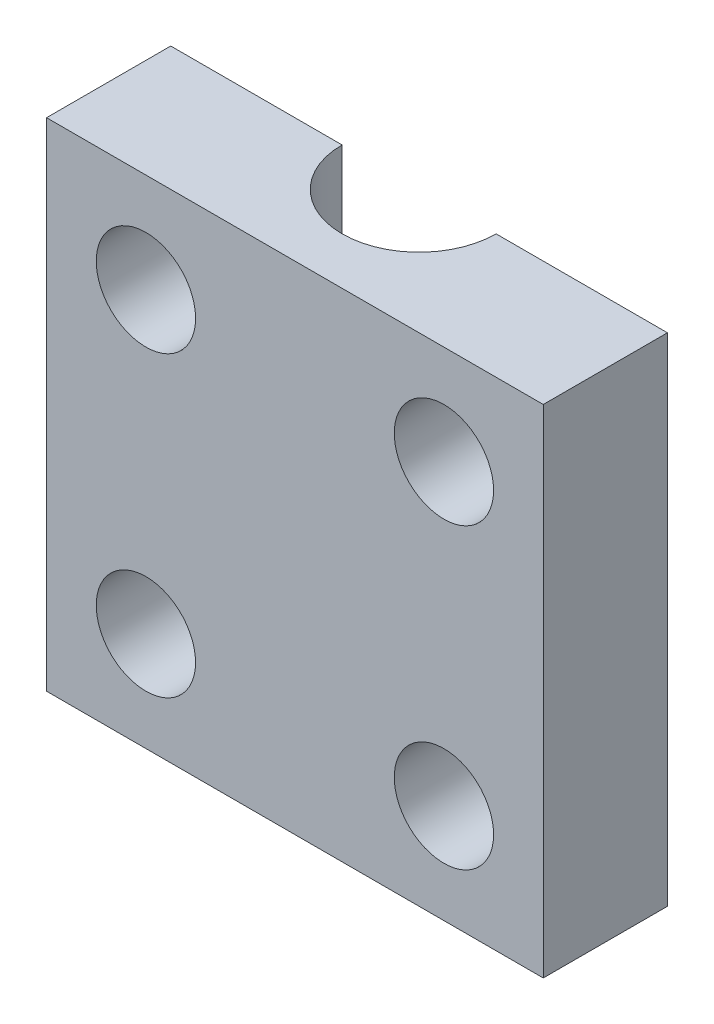
ISO-10303-21;
HEADER;
FILE_DESCRIPTION(('STEP AP214'),'2;1');
FILE_NAME('part.step','',(''),(''),'','','');
FILE_SCHEMA(('AUTOMOTIVE_DESIGN { 1 0 10303 214 1 1 1 1 }'));
ENDSEC;
DATA;
#1=APPLICATION_CONTEXT('core data for automotive mechanical design processes');
#2=APPLICATION_PROTOCOL_DEFINITION('international standard','automotive_design',2000,#1);
#3=PRODUCT_CONTEXT('',#1,'mechanical');
#4=PRODUCT('Part','Part','',(#3));
#5=PRODUCT_RELATED_PRODUCT_CATEGORY('part','',(#4));
#6=PRODUCT_DEFINITION_FORMATION('','',#4);
#7=PRODUCT_DEFINITION_CONTEXT('part definition',#1,'design');
#8=PRODUCT_DEFINITION('design','',#6,#7);
#9=PRODUCT_DEFINITION_SHAPE('','',#8);
#10=(LENGTH_UNIT() NAMED_UNIT(*) SI_UNIT(.MILLI.,.METRE.));
#11=(NAMED_UNIT(*) PLANE_ANGLE_UNIT() SI_UNIT($,.RADIAN.));
#12=(NAMED_UNIT(*) SI_UNIT($,.STERADIAN.) SOLID_ANGLE_UNIT());
#13=UNCERTAINTY_MEASURE_WITH_UNIT(LENGTH_MEASURE(1.E-05),#10,'distance_accuracy_value','');
#14=(GEOMETRIC_REPRESENTATION_CONTEXT(3) GLOBAL_UNCERTAINTY_ASSIGNED_CONTEXT((#13)) GLOBAL_UNIT_ASSIGNED_CONTEXT((#10,
#11,#12)) REPRESENTATION_CONTEXT('',''));
#15=CARTESIAN_POINT('',(0.,0.,0.));
#16=DIRECTION('',(0.,0.,1.));
#17=DIRECTION('',(1.,0.,0.));
#18=AXIS2_PLACEMENT_3D('',#15,#16,#17);
#19=CARTESIAN_POINT('',(0.,0.,0.));
#20=DIRECTION('',(0.,0.,1.));
#21=DIRECTION('',(1.,0.,0.));
#22=AXIS2_PLACEMENT_3D('',#19,#20,#21);
#23=PLANE('',#22);
#24=CARTESIAN_POINT('',(6.,6.,0.));
#25=DIRECTION('',(0.,0.,1.));
#26=DIRECTION('',(1.,0.,0.));
#27=AXIS2_PLACEMENT_3D('',#24,#25,#26);
#28=CIRCLE('',#27,2.);
#29=CARTESIAN_POINT('',(8.,6.,0.));
#30=VERTEX_POINT('',#29);
#31=EDGE_CURVE('E174',#30,#30,#28,.F.);
#32=ORIENTED_EDGE('',*,*,#31,.F.);
#33=EDGE_LOOP('',(#32));
#34=FACE_BOUND('',#33,.T.);
#35=CARTESIAN_POINT('',(6.,-6.,0.));
#36=DIRECTION('',(0.,0.,1.));
#37=DIRECTION('',(1.,0.,0.));
#38=AXIS2_PLACEMENT_3D('',#35,#36,#37);
#39=CIRCLE('',#38,2.);
#40=CARTESIAN_POINT('',(8.,-6.,0.));
#41=VERTEX_POINT('',#40);
#42=EDGE_CURVE('E183',#41,#41,#39,.F.);
#43=ORIENTED_EDGE('',*,*,#42,.F.);
#44=EDGE_LOOP('',(#43));
#45=FACE_BOUND('',#44,.T.);
#46=DIRECTION('',(1.,0.,0.));
#47=VECTOR('',#46,1.);
#48=CARTESIAN_POINT('',(-10.,-10.,0.));
#49=LINE('',#48,#47);
#50=CARTESIAN_POINT('',(3.1,-10.,0.));
#51=VERTEX_POINT('',#50);
#52=CARTESIAN_POINT('',(10.,-10.,0.));
#53=VERTEX_POINT('',#52);
#54=EDGE_CURVE('E118',#51,#53,#49,.T.);
#55=ORIENTED_EDGE('',*,*,#54,.F.);
#56=DIRECTION('',(0.,1.,0.));
#57=VECTOR('',#56,1.);
#58=CARTESIAN_POINT('',(3.1,-10.001,0.));
#59=LINE('',#58,#57);
#60=CARTESIAN_POINT('',(3.1,10.,0.));
#61=VERTEX_POINT('',#60);
#62=EDGE_CURVE('E108',#61,#51,#59,.F.);
#63=ORIENTED_EDGE('',*,*,#62,.F.);
#64=DIRECTION('',(-1.,0.,0.));
#65=VECTOR('',#64,1.);
#66=CARTESIAN_POINT('',(-10.,10.,0.));
#67=LINE('',#66,#65);
#68=CARTESIAN_POINT('',(10.,10.,0.));
#69=VERTEX_POINT('',#68);
#70=EDGE_CURVE('E117',#69,#61,#67,.T.);
#71=ORIENTED_EDGE('',*,*,#70,.F.);
#72=DIRECTION('',(0.,1.,0.));
#73=VECTOR('',#72,1.);
#74=CARTESIAN_POINT('',(10.,10.,0.));
#75=LINE('',#74,#73);
#76=EDGE_CURVE('E131',#53,#69,#75,.T.);
#77=ORIENTED_EDGE('',*,*,#76,.F.);
#78=EDGE_LOOP('',(#55,#63,#71,#77));
#79=FACE_BOUND('',#78,.T.);
#80=ADVANCED_FACE('F45',(#34,#45,#79),#23,.F.);
#81=CARTESIAN_POINT('',(-10.,10.,5.));
#82=DIRECTION('',(1.,0.,0.));
#83=DIRECTION('',(0.,0.,-1.));
#84=AXIS2_PLACEMENT_3D('',#81,#82,#83);
#85=PLANE('',#84);
#86=DIRECTION('',(0.,-1.,0.));
#87=VECTOR('',#86,1.);
#88=CARTESIAN_POINT('',(-10.,10.,0.));
#89=LINE('',#88,#87);
#90=CARTESIAN_POINT('',(-10.,10.,0.));
#91=VERTEX_POINT('',#90);
#92=CARTESIAN_POINT('',(-10.,-10.,0.));
#93=VERTEX_POINT('',#92);
#94=EDGE_CURVE('E150',#91,#93,#89,.T.);
#95=ORIENTED_EDGE('',*,*,#94,.T.);
#96=DIRECTION('',(0.,0.,-1.));
#97=VECTOR('',#96,1.);
#98=CARTESIAN_POINT('',(-10.,-10.,5.));
#99=LINE('',#98,#97);
#100=CARTESIAN_POINT('',(-10.,-10.,5.));
#101=VERTEX_POINT('',#100);
#102=EDGE_CURVE('E11',#101,#93,#99,.T.);
#103=ORIENTED_EDGE('',*,*,#102,.F.);
#104=DIRECTION('',(0.,-1.,0.));
#105=VECTOR('',#104,1.);
#106=CARTESIAN_POINT('',(-10.,10.,5.));
#107=LINE('',#106,#105);
#108=CARTESIAN_POINT('',(-10.,10.,5.));
#109=VERTEX_POINT('',#108);
#110=EDGE_CURVE('E126',#109,#101,#107,.T.);
#111=ORIENTED_EDGE('',*,*,#110,.F.);
#112=DIRECTION('',(0.,0.,-1.));
#113=VECTOR('',#112,1.);
#114=CARTESIAN_POINT('',(-10.,10.,5.));
#115=LINE('',#114,#113);
#116=EDGE_CURVE('E135',#109,#91,#115,.T.);
#117=ORIENTED_EDGE('',*,*,#116,.T.);
#118=EDGE_LOOP('',(#95,#103,#111,#117));
#119=FACE_BOUND('',#118,.T.);
#120=ADVANCED_FACE('F47',(#119),#85,.F.);
#121=CARTESIAN_POINT('',(-10.,-10.,5.));
#122=DIRECTION('',(0.,1.,0.));
#123=DIRECTION('',(0.,0.,1.));
#124=AXIS2_PLACEMENT_3D('',#121,#122,#123);
#125=PLANE('',#124);
#126=CARTESIAN_POINT('',(-3.1,-10.,0.));
#127=VERTEX_POINT('',#126);
#128=EDGE_CURVE('E146',#93,#127,#49,.T.);
#129=ORIENTED_EDGE('',*,*,#128,.T.);
#130=CARTESIAN_POINT('',(0.,-10.,0.));
#131=DIRECTION('',(0.,1.,0.));
#132=DIRECTION('',(0.,0.,1.));
#133=AXIS2_PLACEMENT_3D('',#130,#131,#132);
#134=CIRCLE('',#133,3.1);
#135=EDGE_CURVE('E61',#51,#127,#134,.F.);
#136=ORIENTED_EDGE('',*,*,#135,.F.);
#137=ORIENTED_EDGE('',*,*,#54,.T.);
#138=DIRECTION('',(0.,0.,-1.));
#139=VECTOR('',#138,1.);
#140=CARTESIAN_POINT('',(10.,-10.,5.));
#141=LINE('',#140,#139);
#142=CARTESIAN_POINT('',(10.,-10.,5.));
#143=VERTEX_POINT('',#142);
#144=EDGE_CURVE('E54',#143,#53,#141,.T.);
#145=ORIENTED_EDGE('',*,*,#144,.F.);
#146=DIRECTION('',(1.,0.,0.));
#147=VECTOR('',#146,1.);
#148=CARTESIAN_POINT('',(-10.,-10.,5.));
#149=LINE('',#148,#147);
#150=EDGE_CURVE('E98',#101,#143,#149,.T.);
#151=ORIENTED_EDGE('',*,*,#150,.F.);
#152=ORIENTED_EDGE('',*,*,#102,.T.);
#153=EDGE_LOOP('',(#129,#136,#137,#145,#151,#152));
#154=FACE_BOUND('',#153,.T.);
#155=ADVANCED_FACE('F212',(#154),#125,.F.);
#156=CARTESIAN_POINT('',(10.,10.,5.));
#157=DIRECTION('',(-1.,0.,0.));
#158=DIRECTION('',(0.,0.,1.));
#159=AXIS2_PLACEMENT_3D('',#156,#157,#158);
#160=PLANE('',#159);
#161=ORIENTED_EDGE('',*,*,#76,.T.);
#162=DIRECTION('',(0.,0.,-1.));
#163=VECTOR('',#162,1.);
#164=CARTESIAN_POINT('',(10.,10.,5.));
#165=LINE('',#164,#163);
#166=CARTESIAN_POINT('',(10.,10.,5.));
#167=VERTEX_POINT('',#166);
#168=EDGE_CURVE('E124',#167,#69,#165,.T.);
#169=ORIENTED_EDGE('',*,*,#168,.F.);
#170=DIRECTION('',(0.,1.,0.));
#171=VECTOR('',#170,1.);
#172=CARTESIAN_POINT('',(10.,10.,5.));
#173=LINE('',#172,#171);
#174=EDGE_CURVE('E144',#143,#167,#173,.T.);
#175=ORIENTED_EDGE('',*,*,#174,.F.);
#176=ORIENTED_EDGE('',*,*,#144,.T.);
#177=EDGE_LOOP('',(#161,#169,#175,#176));
#178=FACE_BOUND('',#177,.T.);
#179=ADVANCED_FACE('F143',(#178),#160,.F.);
#180=CARTESIAN_POINT('',(-10.,10.,5.));
#181=DIRECTION('',(0.,-1.,0.));
#182=DIRECTION('',(0.,0.,-1.));
#183=AXIS2_PLACEMENT_3D('',#180,#181,#182);
#184=PLANE('',#183);
#185=ORIENTED_EDGE('',*,*,#70,.T.);
#186=CARTESIAN_POINT('',(0.,10.,0.));
#187=DIRECTION('',(0.,1.,0.));
#188=DIRECTION('',(0.,0.,1.));
#189=AXIS2_PLACEMENT_3D('',#186,#187,#188);
#190=CIRCLE('',#189,3.1);
#191=CARTESIAN_POINT('',(-3.1,10.,0.));
#192=VERTEX_POINT('',#191);
#193=EDGE_CURVE('E105',#192,#61,#190,.T.);
#194=ORIENTED_EDGE('',*,*,#193,.F.);
#195=EDGE_CURVE('E91',#192,#91,#67,.T.);
#196=ORIENTED_EDGE('',*,*,#195,.T.);
#197=ORIENTED_EDGE('',*,*,#116,.F.);
#198=DIRECTION('',(-1.,0.,0.));
#199=VECTOR('',#198,1.);
#200=CARTESIAN_POINT('',(-10.,10.,5.));
#201=LINE('',#200,#199);
#202=EDGE_CURVE('E70',#167,#109,#201,.T.);
#203=ORIENTED_EDGE('',*,*,#202,.F.);
#204=ORIENTED_EDGE('',*,*,#168,.T.);
#205=EDGE_LOOP('',(#185,#194,#196,#197,#203,#204));
#206=FACE_BOUND('',#205,.T.);
#207=ADVANCED_FACE('F122',(#206),#184,.F.);
#208=CARTESIAN_POINT('',(0.,0.,5.));
#209=DIRECTION('',(0.,0.,1.));
#210=DIRECTION('',(1.,0.,0.));
#211=AXIS2_PLACEMENT_3D('',#208,#209,#210);
#212=PLANE('',#211);
#213=CARTESIAN_POINT('',(6.,6.,5.));
#214=DIRECTION('',(0.,0.,1.));
#215=DIRECTION('',(1.,0.,0.));
#216=AXIS2_PLACEMENT_3D('',#213,#214,#215);
#217=CIRCLE('',#216,2.);
#218=CARTESIAN_POINT('',(8.,6.,5.));
#219=VERTEX_POINT('',#218);
#220=EDGE_CURVE('E179',#219,#219,#217,.T.);
#221=ORIENTED_EDGE('',*,*,#220,.F.);
#222=EDGE_LOOP('',(#221));
#223=FACE_BOUND('',#222,.T.);
#224=CARTESIAN_POINT('',(6.,-6.,5.));
#225=DIRECTION('',(0.,0.,1.));
#226=DIRECTION('',(1.,0.,0.));
#227=AXIS2_PLACEMENT_3D('',#224,#225,#226);
#228=CIRCLE('',#227,2.);
#229=CARTESIAN_POINT('',(8.,-6.,5.));
#230=VERTEX_POINT('',#229);
#231=EDGE_CURVE('E178',#230,#230,#228,.T.);
#232=ORIENTED_EDGE('',*,*,#231,.F.);
#233=EDGE_LOOP('',(#232));
#234=FACE_BOUND('',#233,.T.);
#235=CARTESIAN_POINT('',(-6.,-6.,5.));
#236=DIRECTION('',(0.,0.,1.));
#237=DIRECTION('',(1.,0.,0.));
#238=AXIS2_PLACEMENT_3D('',#235,#236,#237);
#239=CIRCLE('',#238,2.);
#240=CARTESIAN_POINT('',(-4.,-6.,5.));
#241=VERTEX_POINT('',#240);
#242=EDGE_CURVE('E187',#241,#241,#239,.T.);
#243=ORIENTED_EDGE('',*,*,#242,.F.);
#244=EDGE_LOOP('',(#243));
#245=FACE_BOUND('',#244,.T.);
#246=CARTESIAN_POINT('',(-6.,6.,5.));
#247=DIRECTION('',(0.,0.,1.));
#248=DIRECTION('',(1.,0.,0.));
#249=AXIS2_PLACEMENT_3D('',#246,#247,#248);
#250=CIRCLE('',#249,2.);
#251=CARTESIAN_POINT('',(-4.,6.,5.));
#252=VERTEX_POINT('',#251);
#253=EDGE_CURVE('E169',#252,#252,#250,.T.);
#254=ORIENTED_EDGE('',*,*,#253,.F.);
#255=EDGE_LOOP('',(#254));
#256=FACE_BOUND('',#255,.T.);
#257=ORIENTED_EDGE('',*,*,#110,.T.);
#258=ORIENTED_EDGE('',*,*,#150,.T.);
#259=ORIENTED_EDGE('',*,*,#174,.T.);
#260=ORIENTED_EDGE('',*,*,#202,.T.);
#261=EDGE_LOOP('',(#257,#258,#259,#260));
#262=FACE_BOUND('',#261,.T.);
#263=ADVANCED_FACE('F201',(#223,#234,#245,#256,#262),#212,.T.);
#264=CARTESIAN_POINT('',(-6.,-6.,0.));
#265=DIRECTION('',(0.,0.,1.));
#266=DIRECTION('',(1.,0.,0.));
#267=AXIS2_PLACEMENT_3D('',#264,#265,#266);
#268=CIRCLE('',#267,2.);
#269=CARTESIAN_POINT('',(-4.,-6.,0.));
#270=VERTEX_POINT('',#269);
#271=EDGE_CURVE('E173',#270,#270,#268,.F.);
#272=ORIENTED_EDGE('',*,*,#271,.F.);
#273=EDGE_LOOP('',(#272));
#274=FACE_BOUND('',#273,.T.);
#275=CARTESIAN_POINT('',(-6.,6.,0.));
#276=DIRECTION('',(0.,0.,1.));
#277=DIRECTION('',(1.,0.,0.));
#278=AXIS2_PLACEMENT_3D('',#275,#276,#277);
#279=CIRCLE('',#278,2.);
#280=CARTESIAN_POINT('',(-4.,6.,0.));
#281=VERTEX_POINT('',#280);
#282=EDGE_CURVE('E165',#281,#281,#279,.F.);
#283=ORIENTED_EDGE('',*,*,#282,.F.);
#284=EDGE_LOOP('',(#283));
#285=FACE_BOUND('',#284,.T.);
#286=ORIENTED_EDGE('',*,*,#195,.F.);
#287=DIRECTION('',(0.,1.,0.));
#288=VECTOR('',#287,1.);
#289=CARTESIAN_POINT('',(-3.1,-10.001,0.));
#290=LINE('',#289,#288);
#291=EDGE_CURVE('E109',#127,#192,#290,.T.);
#292=ORIENTED_EDGE('',*,*,#291,.F.);
#293=ORIENTED_EDGE('',*,*,#128,.F.);
#294=ORIENTED_EDGE('',*,*,#94,.F.);
#295=EDGE_LOOP('',(#286,#292,#293,#294));
#296=FACE_BOUND('',#295,.T.);
#297=ADVANCED_FACE('F204',(#274,#285,#296),#23,.F.);
#298=CARTESIAN_POINT('',(0.,-10.001,0.));
#299=DIRECTION('',(0.,1.,0.));
#300=DIRECTION('',(0.,0.,1.));
#301=AXIS2_PLACEMENT_3D('',#298,#299,#300);
#302=CYLINDRICAL_SURFACE('',#301,3.1);
#303=ORIENTED_EDGE('',*,*,#62,.T.);
#304=ORIENTED_EDGE('',*,*,#135,.T.);
#305=ORIENTED_EDGE('',*,*,#291,.T.);
#306=ORIENTED_EDGE('',*,*,#193,.T.);
#307=EDGE_LOOP('',(#303,#304,#305,#306));
#308=FACE_BOUND('',#307,.T.);
#309=ADVANCED_FACE('F107',(#308),#302,.F.);
#310=CARTESIAN_POINT('',(-6.,6.,-0.00100000000000013));
#311=DIRECTION('',(0.,0.,1.));
#312=DIRECTION('',(1.,0.,0.));
#313=AXIS2_PLACEMENT_3D('',#310,#311,#312);
#314=CYLINDRICAL_SURFACE('',#313,2.);
#315=ORIENTED_EDGE('',*,*,#253,.T.);
#316=EDGE_LOOP('',(#315));
#317=FACE_BOUND('',#316,.T.);
#318=ORIENTED_EDGE('',*,*,#282,.T.);
#319=EDGE_LOOP('',(#318));
#320=FACE_BOUND('',#319,.T.);
#321=ADVANCED_FACE('F234',(#317,#320),#314,.F.);
#322=CARTESIAN_POINT('',(-6.,-6.,-0.00100000000000013));
#323=DIRECTION('',(0.,0.,1.));
#324=DIRECTION('',(1.,0.,0.));
#325=AXIS2_PLACEMENT_3D('',#322,#323,#324);
#326=CYLINDRICAL_SURFACE('',#325,2.);
#327=ORIENTED_EDGE('',*,*,#242,.T.);
#328=EDGE_LOOP('',(#327));
#329=FACE_BOUND('',#328,.T.);
#330=ORIENTED_EDGE('',*,*,#271,.T.);
#331=EDGE_LOOP('',(#330));
#332=FACE_BOUND('',#331,.T.);
#333=ADVANCED_FACE('F198',(#329,#332),#326,.F.);
#334=CARTESIAN_POINT('',(6.,-6.,-0.00100000000000013));
#335=DIRECTION('',(0.,0.,1.));
#336=DIRECTION('',(1.,0.,0.));
#337=AXIS2_PLACEMENT_3D('',#334,#335,#336);
#338=CYLINDRICAL_SURFACE('',#337,2.);
#339=ORIENTED_EDGE('',*,*,#231,.T.);
#340=EDGE_LOOP('',(#339));
#341=FACE_BOUND('',#340,.T.);
#342=ORIENTED_EDGE('',*,*,#42,.T.);
#343=EDGE_LOOP('',(#342));
#344=FACE_BOUND('',#343,.T.);
#345=ADVANCED_FACE('F246',(#341,#344),#338,.F.);
#346=CARTESIAN_POINT('',(6.,6.,-0.00100000000000013));
#347=DIRECTION('',(0.,0.,1.));
#348=DIRECTION('',(1.,0.,0.));
#349=AXIS2_PLACEMENT_3D('',#346,#347,#348);
#350=CYLINDRICAL_SURFACE('',#349,2.);
#351=ORIENTED_EDGE('',*,*,#220,.T.);
#352=EDGE_LOOP('',(#351));
#353=FACE_BOUND('',#352,.T.);
#354=ORIENTED_EDGE('',*,*,#31,.T.);
#355=EDGE_LOOP('',(#354));
#356=FACE_BOUND('',#355,.T.);
#357=ADVANCED_FACE('F249',(#353,#356),#350,.F.);
#358=CLOSED_SHELL('',(#80,#120,#155,#179,#207,#263,#297,#309,#321,#333,#345,#357));
#359=MANIFOLD_SOLID_BREP('B2',#358);
#360=ADVANCED_BREP_SHAPE_REPRESENTATION('',(#18,#359),#14);
#361=SHAPE_DEFINITION_REPRESENTATION(#9,#360);
ENDSEC;
END-ISO-10303-21;
